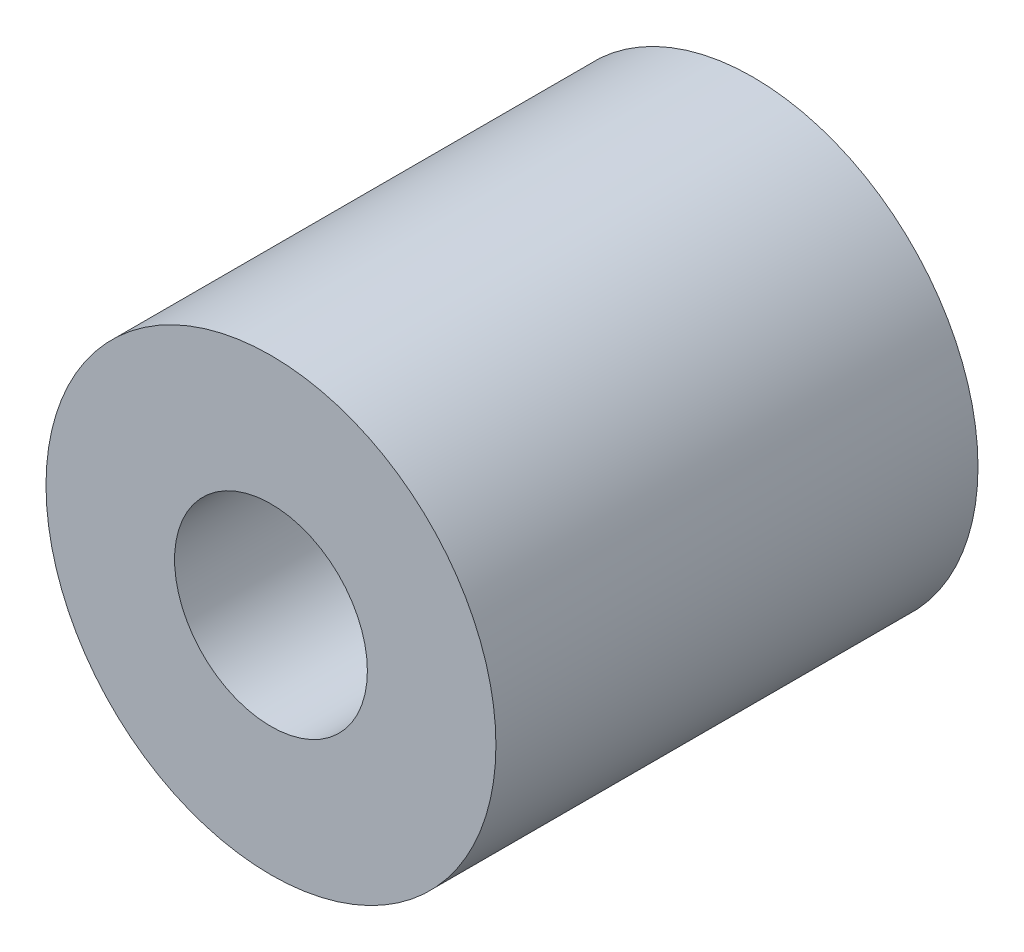
ISO-10303-21;
HEADER;
FILE_DESCRIPTION(('STEP AP214'),'2;1');
FILE_NAME('part.step','',(''),(''),'','','');
FILE_SCHEMA(('AUTOMOTIVE_DESIGN { 1 0 10303 214 1 1 1 1 }'));
ENDSEC;
DATA;
#1=APPLICATION_CONTEXT('core data for automotive mechanical design processes');
#2=APPLICATION_PROTOCOL_DEFINITION('international standard','automotive_design',2000,#1);
#3=PRODUCT_CONTEXT('',#1,'mechanical');
#4=PRODUCT('Part','Part','',(#3));
#5=PRODUCT_RELATED_PRODUCT_CATEGORY('part','',(#4));
#6=PRODUCT_DEFINITION_FORMATION('','',#4);
#7=PRODUCT_DEFINITION_CONTEXT('part definition',#1,'design');
#8=PRODUCT_DEFINITION('design','',#6,#7);
#9=PRODUCT_DEFINITION_SHAPE('','',#8);
#10=(LENGTH_UNIT() NAMED_UNIT(*) SI_UNIT(.MILLI.,.METRE.));
#11=(NAMED_UNIT(*) PLANE_ANGLE_UNIT() SI_UNIT($,.RADIAN.));
#12=(NAMED_UNIT(*) SI_UNIT($,.STERADIAN.) SOLID_ANGLE_UNIT());
#13=UNCERTAINTY_MEASURE_WITH_UNIT(LENGTH_MEASURE(1.E-05),#10,'distance_accuracy_value','');
#14=(GEOMETRIC_REPRESENTATION_CONTEXT(3) GLOBAL_UNCERTAINTY_ASSIGNED_CONTEXT((#13)) GLOBAL_UNIT_ASSIGNED_CONTEXT((#10,
#11,#12)) REPRESENTATION_CONTEXT('',''));
#15=CARTESIAN_POINT('',(0.,0.,0.));
#16=DIRECTION('',(0.,0.,1.));
#17=DIRECTION('',(1.,0.,0.));
#18=AXIS2_PLACEMENT_3D('',#15,#16,#17);
#19=CARTESIAN_POINT('',(0.,0.,15.));
#20=DIRECTION('',(0.,0.,1.));
#21=DIRECTION('',(1.,0.,0.));
#22=AXIS2_PLACEMENT_3D('',#19,#20,#21);
#23=PLANE('',#22);
#24=CARTESIAN_POINT('',(0.,0.,15.));
#25=DIRECTION('',(0.,0.,1.));
#26=DIRECTION('',(1.,0.,0.));
#27=AXIS2_PLACEMENT_3D('',#24,#25,#26);
#28=CIRCLE('',#27,7.);
#29=CARTESIAN_POINT('',(7.,0.,15.));
#30=VERTEX_POINT('',#29);
#31=EDGE_CURVE('E10',#30,#30,#28,.T.);
#32=ORIENTED_EDGE('',*,*,#31,.T.);
#33=EDGE_LOOP('',(#32));
#34=FACE_BOUND('',#33,.T.);
#35=CARTESIAN_POINT('',(0.,0.,15.));
#36=DIRECTION('',(0.,0.,1.));
#37=DIRECTION('',(1.,0.,0.));
#38=AXIS2_PLACEMENT_3D('',#35,#36,#37);
#39=CIRCLE('',#38,3.);
#40=CARTESIAN_POINT('',(3.,0.,15.));
#41=VERTEX_POINT('',#40);
#42=EDGE_CURVE('E40',#41,#41,#39,.T.);
#43=ORIENTED_EDGE('',*,*,#42,.F.);
#44=EDGE_LOOP('',(#43));
#45=FACE_BOUND('',#44,.T.);
#46=ADVANCED_FACE('F29',(#34,#45),#23,.T.);
#47=CARTESIAN_POINT('',(0.,0.,0.));
#48=DIRECTION('',(0.,0.,1.));
#49=DIRECTION('',(1.,0.,0.));
#50=AXIS2_PLACEMENT_3D('',#47,#48,#49);
#51=PLANE('',#50);
#52=CARTESIAN_POINT('',(0.,0.,0.));
#53=DIRECTION('',(0.,0.,1.));
#54=DIRECTION('',(1.,0.,0.));
#55=AXIS2_PLACEMENT_3D('',#52,#53,#54);
#56=CIRCLE('',#55,7.);
#57=CARTESIAN_POINT('',(7.,0.,0.));
#58=VERTEX_POINT('',#57);
#59=EDGE_CURVE('E33',#58,#58,#56,.T.);
#60=ORIENTED_EDGE('',*,*,#59,.F.);
#61=EDGE_LOOP('',(#60));
#62=FACE_BOUND('',#61,.T.);
#63=CARTESIAN_POINT('',(0.,0.,0.));
#64=DIRECTION('',(0.,0.,1.));
#65=DIRECTION('',(1.,0.,0.));
#66=AXIS2_PLACEMENT_3D('',#63,#64,#65);
#67=CIRCLE('',#66,3.);
#68=CARTESIAN_POINT('',(3.,0.,0.));
#69=VERTEX_POINT('',#68);
#70=EDGE_CURVE('E42',#69,#69,#67,.T.);
#71=ORIENTED_EDGE('',*,*,#70,.T.);
#72=EDGE_LOOP('',(#71));
#73=FACE_BOUND('',#72,.T.);
#74=ADVANCED_FACE('F52',(#62,#73),#51,.F.);
#75=CARTESIAN_POINT('',(0.,0.,15.));
#76=DIRECTION('',(0.,0.,-1.));
#77=DIRECTION('',(-1.,0.,0.));
#78=AXIS2_PLACEMENT_3D('',#75,#76,#77);
#79=CYLINDRICAL_SURFACE('',#78,7.);
#80=ORIENTED_EDGE('',*,*,#31,.F.);
#81=EDGE_LOOP('',(#80));
#82=FACE_BOUND('',#81,.T.);
#83=ORIENTED_EDGE('',*,*,#59,.T.);
#84=EDGE_LOOP('',(#83));
#85=FACE_BOUND('',#84,.T.);
#86=ADVANCED_FACE('F31',(#82,#85),#79,.T.);
#87=CARTESIAN_POINT('',(0.,0.,15.));
#88=DIRECTION('',(0.,0.,-1.));
#89=DIRECTION('',(-1.,0.,0.));
#90=AXIS2_PLACEMENT_3D('',#87,#88,#89);
#91=CYLINDRICAL_SURFACE('',#90,3.);
#92=ORIENTED_EDGE('',*,*,#42,.T.);
#93=EDGE_LOOP('',(#92));
#94=FACE_BOUND('',#93,.T.);
#95=ORIENTED_EDGE('',*,*,#70,.F.);
#96=EDGE_LOOP('',(#95));
#97=FACE_BOUND('',#96,.T.);
#98=ADVANCED_FACE('F48',(#94,#97),#91,.F.);
#99=CLOSED_SHELL('',(#46,#74,#86,#98));
#100=MANIFOLD_SOLID_BREP('B2',#99);
#101=ADVANCED_BREP_SHAPE_REPRESENTATION('',(#18,#100),#14);
#102=SHAPE_DEFINITION_REPRESENTATION(#9,#101);
ENDSEC;
END-ISO-10303-21;
